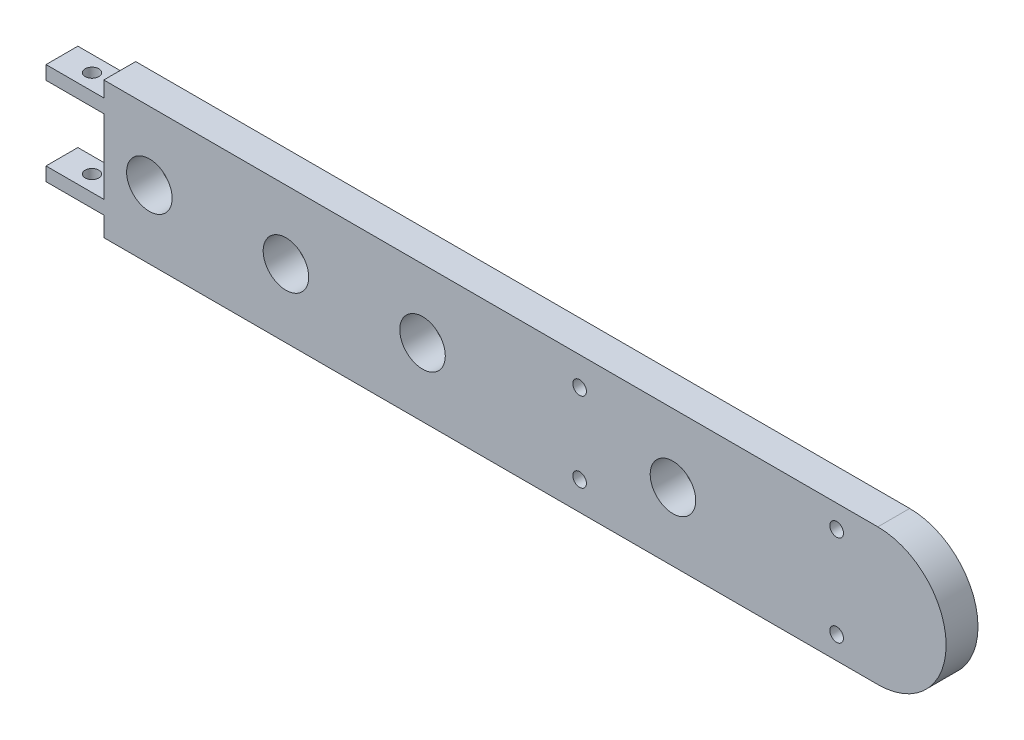
ISO-10303-21;
HEADER;
FILE_DESCRIPTION(('STEP AP214'),'2;1');
FILE_NAME('part.step','',(''),(''),'','','');
FILE_SCHEMA(('AUTOMOTIVE_DESIGN { 1 0 10303 214 1 1 1 1 }'));
ENDSEC;
DATA;
#1=APPLICATION_CONTEXT('core data for automotive mechanical design processes');
#2=APPLICATION_PROTOCOL_DEFINITION('international standard','automotive_design',2000,#1);
#3=PRODUCT_CONTEXT('',#1,'mechanical');
#4=PRODUCT('Part','Part','',(#3));
#5=PRODUCT_RELATED_PRODUCT_CATEGORY('part','',(#4));
#6=PRODUCT_DEFINITION_FORMATION('','',#4);
#7=PRODUCT_DEFINITION_CONTEXT('part definition',#1,'design');
#8=PRODUCT_DEFINITION('design','',#6,#7);
#9=PRODUCT_DEFINITION_SHAPE('','',#8);
#10=(LENGTH_UNIT() NAMED_UNIT(*) SI_UNIT(.MILLI.,.METRE.));
#11=(NAMED_UNIT(*) PLANE_ANGLE_UNIT() SI_UNIT($,.RADIAN.));
#12=(NAMED_UNIT(*) SI_UNIT($,.STERADIAN.) SOLID_ANGLE_UNIT());
#13=UNCERTAINTY_MEASURE_WITH_UNIT(LENGTH_MEASURE(1.E-05),#10,'distance_accuracy_value','');
#14=(GEOMETRIC_REPRESENTATION_CONTEXT(3) GLOBAL_UNCERTAINTY_ASSIGNED_CONTEXT((#13)) GLOBAL_UNIT_ASSIGNED_CONTEXT((#10,
#11,#12)) REPRESENTATION_CONTEXT('',''));
#15=CARTESIAN_POINT('',(0.,0.,0.));
#16=DIRECTION('',(0.,0.,1.));
#17=DIRECTION('',(1.,0.,0.));
#18=AXIS2_PLACEMENT_3D('',#15,#16,#17);
#19=CARTESIAN_POINT('',(-75.,42.916446054331,-10.001));
#20=DIRECTION('',(1.,0.,0.));
#21=DIRECTION('',(0.,1.,0.));
#22=AXIS2_PLACEMENT_3D('',#19,#20,#21);
#23=PLANE('',#22);
#24=DIRECTION('',(0.,0.,-1.));
#25=VECTOR('',#24,1.);
#26=CARTESIAN_POINT('',(-75.,-3.42000859692146,0.));
#27=LINE('',#26,#25);
#28=CARTESIAN_POINT('',(-75.,-3.42000859692146,6.99999999999999));
#29=VERTEX_POINT('',#28);
#30=CARTESIAN_POINT('',(-75.,-3.42000859692146,0.));
#31=VERTEX_POINT('',#30);
#32=EDGE_CURVE('E271',#29,#31,#27,.T.);
#33=ORIENTED_EDGE('',*,*,#32,.F.);
#34=DIRECTION('',(0.,1.,0.));
#35=VECTOR('',#34,1.);
#36=CARTESIAN_POINT('',(-75.,42.916446054331,6.99999999999999));
#37=LINE('',#36,#35);
#38=CARTESIAN_POINT('',(-75.,0.,6.99999999999999));
#39=VERTEX_POINT('',#38);
#40=EDGE_CURVE('E340',#29,#39,#37,.T.);
#41=ORIENTED_EDGE('',*,*,#40,.T.);
#42=DIRECTION('',(0.,0.,-1.));
#43=VECTOR('',#42,1.);
#44=CARTESIAN_POINT('',(-75.,0.,-10.001));
#45=LINE('',#44,#43);
#46=CARTESIAN_POINT('',(-75.,0.,0.));
#47=VERTEX_POINT('',#46);
#48=EDGE_CURVE('E331',#39,#47,#45,.T.);
#49=ORIENTED_EDGE('',*,*,#48,.T.);
#50=DIRECTION('',(0.,1.,0.));
#51=VECTOR('',#50,1.);
#52=CARTESIAN_POINT('',(-75.,42.916446054331,0.));
#53=LINE('',#52,#51);
#54=EDGE_CURVE('E178',#31,#47,#53,.T.);
#55=ORIENTED_EDGE('',*,*,#54,.F.);
#56=EDGE_LOOP('',(#33,#41,#49,#55));
#57=FACE_BOUND('',#56,.T.);
#58=ADVANCED_FACE('F161',(#57),#23,.F.);
#59=DIRECTION('',(0.,0.,1.));
#60=VECTOR('',#59,1.);
#61=CARTESIAN_POINT('',(-75.,-6.42000859692146,0.));
#62=LINE('',#61,#60);
#63=CARTESIAN_POINT('',(-75.,-6.42000859692145,0.));
#64=VERTEX_POINT('',#63);
#65=CARTESIAN_POINT('',(-75.,-6.42000859692146,7.));
#66=VERTEX_POINT('',#65);
#67=EDGE_CURVE('E186',#64,#66,#62,.T.);
#68=ORIENTED_EDGE('',*,*,#67,.F.);
#69=CARTESIAN_POINT('',(-75.,-22.7,0.));
#70=VERTEX_POINT('',#69);
#71=EDGE_CURVE('E277',#70,#64,#53,.T.);
#72=ORIENTED_EDGE('',*,*,#71,.F.);
#73=DIRECTION('',(0.,0.,-1.));
#74=VECTOR('',#73,1.);
#75=CARTESIAN_POINT('',(-75.,-22.7,0.));
#76=LINE('',#75,#74);
#77=CARTESIAN_POINT('',(-75.,-22.7,6.99999999999999));
#78=VERTEX_POINT('',#77);
#79=EDGE_CURVE('E300',#78,#70,#76,.T.);
#80=ORIENTED_EDGE('',*,*,#79,.F.);
#81=EDGE_CURVE('E344',#78,#66,#37,.T.);
#82=ORIENTED_EDGE('',*,*,#81,.T.);
#83=EDGE_LOOP('',(#68,#72,#80,#82));
#84=FACE_BOUND('',#83,.T.);
#85=ADVANCED_FACE('F397',(#84),#23,.F.);
#86=DIRECTION('',(0.,0.,1.));
#87=VECTOR('',#86,1.);
#88=CARTESIAN_POINT('',(-75.,-25.7,0.));
#89=LINE('',#88,#87);
#90=CARTESIAN_POINT('',(-75.,-25.7,0.));
#91=VERTEX_POINT('',#90);
#92=CARTESIAN_POINT('',(-75.,-25.7,6.99999999999999));
#93=VERTEX_POINT('',#92);
#94=EDGE_CURVE('E303',#91,#93,#89,.T.);
#95=ORIENTED_EDGE('',*,*,#94,.F.);
#96=CARTESIAN_POINT('',(-75.,-30.,0.));
#97=VERTEX_POINT('',#96);
#98=EDGE_CURVE('E337',#97,#91,#53,.T.);
#99=ORIENTED_EDGE('',*,*,#98,.F.);
#100=DIRECTION('',(0.,0.,1.));
#101=VECTOR('',#100,1.);
#102=CARTESIAN_POINT('',(-75.,-30.,-10.001));
#103=LINE('',#102,#101);
#104=CARTESIAN_POINT('',(-75.,-30.,6.99999999999999));
#105=VERTEX_POINT('',#104);
#106=EDGE_CURVE('E335',#97,#105,#103,.T.);
#107=ORIENTED_EDGE('',*,*,#106,.T.);
#108=EDGE_CURVE('E341',#105,#93,#37,.T.);
#109=ORIENTED_EDGE('',*,*,#108,.T.);
#110=EDGE_LOOP('',(#95,#99,#107,#109));
#111=FACE_BOUND('',#110,.T.);
#112=ADVANCED_FACE('F424',(#111),#23,.F.);
#113=CARTESIAN_POINT('',(-200.,-15.,0.));
#114=DIRECTION('',(0.,0.,-1.));
#115=DIRECTION('',(-1.,0.,0.));
#116=AXIS2_PLACEMENT_3D('',#113,#114,#115);
#117=PLANE('',#116);
#118=CARTESIAN_POINT('',(85.95,-25.,0.));
#119=DIRECTION('',(0.,0.,-1.));
#120=DIRECTION('',(-1.,0.,0.));
#121=AXIS2_PLACEMENT_3D('',#118,#119,#120);
#122=CIRCLE('',#121,1.49999999999997);
#123=CARTESIAN_POINT('',(84.45,-25.,0.));
#124=VERTEX_POINT('',#123);
#125=EDGE_CURVE('E319',#124,#124,#122,.T.);
#126=ORIENTED_EDGE('',*,*,#125,.F.);
#127=EDGE_LOOP('',(#126));
#128=FACE_BOUND('',#127,.T.);
#129=CARTESIAN_POINT('',(85.95,-4.99999999999997,0.));
#130=DIRECTION('',(0.,0.,-1.));
#131=DIRECTION('',(-1.,0.,0.));
#132=AXIS2_PLACEMENT_3D('',#129,#130,#131);
#133=CIRCLE('',#132,1.49999999999997);
#134=CARTESIAN_POINT('',(84.45,-4.99999999999997,0.));
#135=VERTEX_POINT('',#134);
#136=EDGE_CURVE('E315',#135,#135,#133,.T.);
#137=ORIENTED_EDGE('',*,*,#136,.F.);
#138=EDGE_LOOP('',(#137));
#139=FACE_BOUND('',#138,.T.);
#140=CARTESIAN_POINT('',(50.,-15.,0.));
#141=DIRECTION('',(0.,0.,-1.));
#142=DIRECTION('',(-1.,0.,0.));
#143=AXIS2_PLACEMENT_3D('',#140,#141,#142);
#144=CIRCLE('',#143,5.);
#145=CARTESIAN_POINT('',(45.,-15.,0.));
#146=VERTEX_POINT('',#145);
#147=EDGE_CURVE('E352',#146,#146,#144,.T.);
#148=ORIENTED_EDGE('',*,*,#147,.F.);
#149=EDGE_LOOP('',(#148));
#150=FACE_BOUND('',#149,.T.);
#151=CARTESIAN_POINT('',(95.,-15.,0.));
#152=DIRECTION('',(0.,0.,1.));
#153=DIRECTION('',(1.,0.,0.));
#154=AXIS2_PLACEMENT_3D('',#151,#152,#153);
#155=CIRCLE('',#154,15.);
#156=CARTESIAN_POINT('',(95.,0.,0.));
#157=VERTEX_POINT('',#156);
#158=CARTESIAN_POINT('',(95.,-30.,0.));
#159=VERTEX_POINT('',#158);
#160=EDGE_CURVE('E323',#157,#159,#155,.F.);
#161=ORIENTED_EDGE('',*,*,#160,.T.);
#162=DIRECTION('',(1.,0.,0.));
#163=VECTOR('',#162,1.);
#164=CARTESIAN_POINT('',(50.,-30.,0.));
#165=LINE('',#164,#163);
#166=EDGE_CURVE('E366',#97,#159,#165,.T.);
#167=ORIENTED_EDGE('',*,*,#166,.F.);
#168=ORIENTED_EDGE('',*,*,#98,.T.);
#169=DIRECTION('',(1.,0.,0.));
#170=VECTOR('',#169,1.);
#171=CARTESIAN_POINT('',(-87.7,-25.7,0.));
#172=LINE('',#171,#170);
#173=CARTESIAN_POINT('',(-87.7,-25.7,0.));
#174=VERTEX_POINT('',#173);
#175=EDGE_CURVE('E287',#174,#91,#172,.T.);
#176=ORIENTED_EDGE('',*,*,#175,.F.);
#177=DIRECTION('',(0.,-1.,0.));
#178=VECTOR('',#177,1.);
#179=CARTESIAN_POINT('',(-87.7,-22.7,0.));
#180=LINE('',#179,#178);
#181=CARTESIAN_POINT('',(-87.7,-22.7,0.));
#182=VERTEX_POINT('',#181);
#183=EDGE_CURVE('E304',#182,#174,#180,.T.);
#184=ORIENTED_EDGE('',*,*,#183,.F.);
#185=DIRECTION('',(1.,0.,0.));
#186=VECTOR('',#185,1.);
#187=CARTESIAN_POINT('',(-87.7,-22.7,0.));
#188=LINE('',#187,#186);
#189=EDGE_CURVE('E297',#182,#70,#188,.T.);
#190=ORIENTED_EDGE('',*,*,#189,.T.);
#191=ORIENTED_EDGE('',*,*,#71,.T.);
#192=DIRECTION('',(1.,0.,0.));
#193=VECTOR('',#192,1.);
#194=CARTESIAN_POINT('',(-87.7,-6.42000859692146,0.));
#195=LINE('',#194,#193);
#196=CARTESIAN_POINT('',(-87.7,-6.42000859692146,0.));
#197=VERTEX_POINT('',#196);
#198=EDGE_CURVE('E256',#197,#64,#195,.T.);
#199=ORIENTED_EDGE('',*,*,#198,.F.);
#200=DIRECTION('',(0.,-1.,0.));
#201=VECTOR('',#200,1.);
#202=CARTESIAN_POINT('',(-87.7,-3.42000859692146,0.));
#203=LINE('',#202,#201);
#204=CARTESIAN_POINT('',(-87.7,-3.42000859692146,0.));
#205=VERTEX_POINT('',#204);
#206=EDGE_CURVE('E262',#205,#197,#203,.T.);
#207=ORIENTED_EDGE('',*,*,#206,.F.);
#208=DIRECTION('',(1.,0.,0.));
#209=VECTOR('',#208,1.);
#210=CARTESIAN_POINT('',(-87.7,-3.42000859692146,0.));
#211=LINE('',#210,#209);
#212=EDGE_CURVE('E391',#205,#31,#211,.T.);
#213=ORIENTED_EDGE('',*,*,#212,.T.);
#214=ORIENTED_EDGE('',*,*,#54,.T.);
#215=DIRECTION('',(-1.,0.,0.));
#216=VECTOR('',#215,1.);
#217=CARTESIAN_POINT('',(-200.,0.,0.));
#218=LINE('',#217,#216);
#219=EDGE_CURVE('E381',#157,#47,#218,.T.);
#220=ORIENTED_EDGE('',*,*,#219,.F.);
#221=EDGE_LOOP('',(#161,#167,#168,#176,#184,#190,#191,#199,#207,#213,#214,#220));
#222=FACE_BOUND('',#221,.T.);
#223=CARTESIAN_POINT('',(29.5,-23.75,0.));
#224=DIRECTION('',(0.,0.,-1.));
#225=DIRECTION('',(-1.,0.,0.));
#226=AXIS2_PLACEMENT_3D('',#223,#224,#225);
#227=CIRCLE('',#226,1.5);
#228=CARTESIAN_POINT('',(28.,-23.75,0.));
#229=VERTEX_POINT('',#228);
#230=EDGE_CURVE('E345',#229,#229,#227,.T.);
#231=ORIENTED_EDGE('',*,*,#230,.F.);
#232=EDGE_LOOP('',(#231));
#233=FACE_BOUND('',#232,.T.);
#234=CARTESIAN_POINT('',(29.5,-6.24999999999997,0.));
#235=DIRECTION('',(0.,0.,-1.));
#236=DIRECTION('',(-1.,0.,0.));
#237=AXIS2_PLACEMENT_3D('',#234,#235,#236);
#238=CIRCLE('',#237,1.5);
#239=CARTESIAN_POINT('',(28.,-6.24999999999997,0.));
#240=VERTEX_POINT('',#239);
#241=EDGE_CURVE('E349',#240,#240,#238,.T.);
#242=ORIENTED_EDGE('',*,*,#241,.F.);
#243=EDGE_LOOP('',(#242));
#244=FACE_BOUND('',#243,.T.);
#245=CARTESIAN_POINT('',(-65.,-15.,0.));
#246=DIRECTION('',(0.,0.,1.));
#247=DIRECTION('',(1.,0.,0.));
#248=AXIS2_PLACEMENT_3D('',#245,#246,#247);
#249=CIRCLE('',#248,4.99999999999999);
#250=CARTESIAN_POINT('',(-60.,-15.,0.));
#251=VERTEX_POINT('',#250);
#252=EDGE_CURVE('E363',#251,#251,#249,.T.);
#253=ORIENTED_EDGE('',*,*,#252,.T.);
#254=EDGE_LOOP('',(#253));
#255=FACE_BOUND('',#254,.T.);
#256=CARTESIAN_POINT('',(-35.,-15.,0.));
#257=DIRECTION('',(0.,0.,1.));
#258=DIRECTION('',(1.,0.,0.));
#259=AXIS2_PLACEMENT_3D('',#256,#257,#258);
#260=CIRCLE('',#259,4.99999999999999);
#261=CARTESIAN_POINT('',(-30.,-15.,0.));
#262=VERTEX_POINT('',#261);
#263=EDGE_CURVE('E370',#262,#262,#260,.T.);
#264=ORIENTED_EDGE('',*,*,#263,.T.);
#265=EDGE_LOOP('',(#264));
#266=FACE_BOUND('',#265,.T.);
#267=CARTESIAN_POINT('',(-5.,-15.,0.));
#268=DIRECTION('',(0.,0.,1.));
#269=DIRECTION('',(1.,0.,0.));
#270=AXIS2_PLACEMENT_3D('',#267,#268,#269);
#271=CIRCLE('',#270,4.99999999999999);
#272=CARTESIAN_POINT('',(0.,-15.,0.));
#273=VERTEX_POINT('',#272);
#274=EDGE_CURVE('E376',#273,#273,#271,.T.);
#275=ORIENTED_EDGE('',*,*,#274,.T.);
#276=EDGE_LOOP('',(#275));
#277=FACE_BOUND('',#276,.T.);
#278=ADVANCED_FACE('F274',(#128,#139,#150,#222,#233,#244,#255,#266,#277),#117,.T.);
#279=CARTESIAN_POINT('',(50.,-30.,6.99999999999999));
#280=DIRECTION('',(0.,1.,0.));
#281=DIRECTION('',(-1.,0.,0.));
#282=AXIS2_PLACEMENT_3D('',#279,#280,#281);
#283=PLANE('',#282);
#284=DIRECTION('',(1.,0.,0.));
#285=VECTOR('',#284,1.);
#286=CARTESIAN_POINT('',(50.,-30.,6.99999999999999));
#287=LINE('',#286,#285);
#288=CARTESIAN_POINT('',(95.,-30.,6.99999999999999));
#289=VERTEX_POINT('',#288);
#290=EDGE_CURVE('E170',#105,#289,#287,.T.);
#291=ORIENTED_EDGE('',*,*,#290,.F.);
#292=ORIENTED_EDGE('',*,*,#106,.F.);
#293=ORIENTED_EDGE('',*,*,#166,.T.);
#294=DIRECTION('',(0.,0.,1.));
#295=VECTOR('',#294,1.);
#296=CARTESIAN_POINT('',(95.,-30.,0.));
#297=LINE('',#296,#295);
#298=EDGE_CURVE('E325',#159,#289,#297,.T.);
#299=ORIENTED_EDGE('',*,*,#298,.T.);
#300=EDGE_LOOP('',(#291,#292,#293,#299));
#301=FACE_BOUND('',#300,.T.);
#302=ADVANCED_FACE('F163',(#301),#283,.F.);
#303=CARTESIAN_POINT('',(-200.,0.,6.99999999999999));
#304=DIRECTION('',(0.,-1.,0.));
#305=DIRECTION('',(1.,0.,0.));
#306=AXIS2_PLACEMENT_3D('',#303,#304,#305);
#307=PLANE('',#306);
#308=ORIENTED_EDGE('',*,*,#219,.T.);
#309=ORIENTED_EDGE('',*,*,#48,.F.);
#310=DIRECTION('',(-1.,0.,0.));
#311=VECTOR('',#310,1.);
#312=CARTESIAN_POINT('',(-200.,0.,6.99999999999999));
#313=LINE('',#312,#311);
#314=CARTESIAN_POINT('',(95.,0.,6.99999999999999));
#315=VERTEX_POINT('',#314);
#316=EDGE_CURVE('E12',#315,#39,#313,.T.);
#317=ORIENTED_EDGE('',*,*,#316,.F.);
#318=DIRECTION('',(0.,0.,1.));
#319=VECTOR('',#318,1.);
#320=CARTESIAN_POINT('',(95.,0.,0.));
#321=LINE('',#320,#319);
#322=EDGE_CURVE('E328',#157,#315,#321,.T.);
#323=ORIENTED_EDGE('',*,*,#322,.F.);
#324=EDGE_LOOP('',(#308,#309,#317,#323));
#325=FACE_BOUND('',#324,.T.);
#326=ADVANCED_FACE('F387',(#325),#307,.F.);
#327=CARTESIAN_POINT('',(-200.,-15.,6.99999999999999));
#328=DIRECTION('',(0.,0.,-1.));
#329=DIRECTION('',(-1.,0.,0.));
#330=AXIS2_PLACEMENT_3D('',#327,#328,#329);
#331=PLANE('',#330);
#332=CARTESIAN_POINT('',(85.95,-25.,6.99999999999999));
#333=DIRECTION('',(0.,0.,1.));
#334=DIRECTION('',(1.,0.,0.));
#335=AXIS2_PLACEMENT_3D('',#332,#333,#334);
#336=CIRCLE('',#335,1.49999999999997);
#337=CARTESIAN_POINT('',(87.45,-25.,6.99999999999999));
#338=VERTEX_POINT('',#337);
#339=EDGE_CURVE('E281',#338,#338,#336,.T.);
#340=ORIENTED_EDGE('',*,*,#339,.F.);
#341=EDGE_LOOP('',(#340));
#342=FACE_BOUND('',#341,.T.);
#343=CARTESIAN_POINT('',(85.95,-4.99999999999997,6.99999999999999));
#344=DIRECTION('',(0.,0.,1.));
#345=DIRECTION('',(1.,0.,0.));
#346=AXIS2_PLACEMENT_3D('',#343,#344,#345);
#347=CIRCLE('',#346,1.49999999999997);
#348=CARTESIAN_POINT('',(87.45,-4.99999999999997,6.99999999999999));
#349=VERTEX_POINT('',#348);
#350=EDGE_CURVE('E278',#349,#349,#347,.T.);
#351=ORIENTED_EDGE('',*,*,#350,.F.);
#352=EDGE_LOOP('',(#351));
#353=FACE_BOUND('',#352,.T.);
#354=CARTESIAN_POINT('',(50.,-15.,6.99999999999999));
#355=DIRECTION('',(0.,0.,-1.));
#356=DIRECTION('',(-1.,0.,0.));
#357=AXIS2_PLACEMENT_3D('',#354,#355,#356);
#358=CIRCLE('',#357,5.);
#359=CARTESIAN_POINT('',(45.,-15.,6.99999999999999));
#360=VERTEX_POINT('',#359);
#361=EDGE_CURVE('E359',#360,#360,#358,.T.);
#362=ORIENTED_EDGE('',*,*,#361,.T.);
#363=EDGE_LOOP('',(#362));
#364=FACE_BOUND('',#363,.T.);
#365=CARTESIAN_POINT('',(29.5,-23.75,6.99999999999999));
#366=DIRECTION('',(0.,0.,-1.));
#367=DIRECTION('',(-1.,0.,0.));
#368=AXIS2_PLACEMENT_3D('',#365,#366,#367);
#369=CIRCLE('',#368,1.5);
#370=CARTESIAN_POINT('',(28.,-23.75,6.99999999999999));
#371=VERTEX_POINT('',#370);
#372=EDGE_CURVE('E348',#371,#371,#369,.F.);
#373=ORIENTED_EDGE('',*,*,#372,.F.);
#374=EDGE_LOOP('',(#373));
#375=FACE_BOUND('',#374,.T.);
#376=CARTESIAN_POINT('',(29.5,-6.24999999999997,6.99999999999999));
#377=DIRECTION('',(0.,0.,-1.));
#378=DIRECTION('',(-1.,0.,0.));
#379=AXIS2_PLACEMENT_3D('',#376,#377,#378);
#380=CIRCLE('',#379,1.5);
#381=CARTESIAN_POINT('',(28.,-6.24999999999997,6.99999999999999));
#382=VERTEX_POINT('',#381);
#383=EDGE_CURVE('E343',#382,#382,#380,.F.);
#384=ORIENTED_EDGE('',*,*,#383,.F.);
#385=EDGE_LOOP('',(#384));
#386=FACE_BOUND('',#385,.T.);
#387=ORIENTED_EDGE('',*,*,#290,.T.);
#388=CARTESIAN_POINT('',(95.,-15.,6.99999999999999));
#389=DIRECTION('',(0.,0.,1.));
#390=DIRECTION('',(1.,0.,0.));
#391=AXIS2_PLACEMENT_3D('',#388,#389,#390);
#392=CIRCLE('',#391,15.);
#393=EDGE_CURVE('E322',#315,#289,#392,.F.);
#394=ORIENTED_EDGE('',*,*,#393,.F.);
#395=ORIENTED_EDGE('',*,*,#316,.T.);
#396=ORIENTED_EDGE('',*,*,#40,.F.);
#397=DIRECTION('',(1.,0.,0.));
#398=VECTOR('',#397,1.);
#399=CARTESIAN_POINT('',(-87.7,-3.42000859692146,7.));
#400=LINE('',#399,#398);
#401=CARTESIAN_POINT('',(-87.7,-3.42000859692146,7.));
#402=VERTEX_POINT('',#401);
#403=EDGE_CURVE('E283',#402,#29,#400,.T.);
#404=ORIENTED_EDGE('',*,*,#403,.F.);
#405=DIRECTION('',(0.,1.,0.));
#406=VECTOR('',#405,1.);
#407=CARTESIAN_POINT('',(-87.7,-3.42000859692146,7.));
#408=LINE('',#407,#406);
#409=CARTESIAN_POINT('',(-87.7,-6.42000859692146,7.));
#410=VERTEX_POINT('',#409);
#411=EDGE_CURVE('E261',#410,#402,#408,.T.);
#412=ORIENTED_EDGE('',*,*,#411,.F.);
#413=DIRECTION('',(1.,0.,0.));
#414=VECTOR('',#413,1.);
#415=CARTESIAN_POINT('',(-87.7,-6.42000859692146,7.));
#416=LINE('',#415,#414);
#417=EDGE_CURVE('E258',#410,#66,#416,.T.);
#418=ORIENTED_EDGE('',*,*,#417,.T.);
#419=ORIENTED_EDGE('',*,*,#81,.F.);
#420=DIRECTION('',(1.,0.,0.));
#421=VECTOR('',#420,1.);
#422=CARTESIAN_POINT('',(-87.7,-22.7,6.99999999999999));
#423=LINE('',#422,#421);
#424=CARTESIAN_POINT('',(-87.7,-22.7,6.99999999999999));
#425=VERTEX_POINT('',#424);
#426=EDGE_CURVE('E294',#425,#78,#423,.T.);
#427=ORIENTED_EDGE('',*,*,#426,.F.);
#428=DIRECTION('',(0.,1.,0.));
#429=VECTOR('',#428,1.);
#430=CARTESIAN_POINT('',(-87.7,-22.7,6.99999999999999));
#431=LINE('',#430,#429);
#432=CARTESIAN_POINT('',(-87.7,-25.7,6.99999999999999));
#433=VERTEX_POINT('',#432);
#434=EDGE_CURVE('E308',#433,#425,#431,.T.);
#435=ORIENTED_EDGE('',*,*,#434,.F.);
#436=DIRECTION('',(1.,0.,0.));
#437=VECTOR('',#436,1.);
#438=CARTESIAN_POINT('',(-87.7,-25.7,6.99999999999999));
#439=LINE('',#438,#437);
#440=EDGE_CURVE('E290',#433,#93,#439,.T.);
#441=ORIENTED_EDGE('',*,*,#440,.T.);
#442=ORIENTED_EDGE('',*,*,#108,.F.);
#443=EDGE_LOOP('',(#387,#394,#395,#396,#404,#412,#418,#419,#427,#435,#441,#442));
#444=FACE_BOUND('',#443,.T.);
#445=CARTESIAN_POINT('',(-65.,-15.,6.99999999999999));
#446=DIRECTION('',(0.,0.,1.));
#447=DIRECTION('',(1.,0.,0.));
#448=AXIS2_PLACEMENT_3D('',#445,#446,#447);
#449=CIRCLE('',#448,4.99999999999999);
#450=CARTESIAN_POINT('',(-60.,-15.,6.99999999999999));
#451=VERTEX_POINT('',#450);
#452=EDGE_CURVE('E367',#451,#451,#449,.T.);
#453=ORIENTED_EDGE('',*,*,#452,.F.);
#454=EDGE_LOOP('',(#453));
#455=FACE_BOUND('',#454,.T.);
#456=CARTESIAN_POINT('',(-35.,-15.,6.99999999999999));
#457=DIRECTION('',(0.,0.,1.));
#458=DIRECTION('',(1.,0.,0.));
#459=AXIS2_PLACEMENT_3D('',#456,#457,#458);
#460=CIRCLE('',#459,4.99999999999999);
#461=CARTESIAN_POINT('',(-30.,-15.,6.99999999999999));
#462=VERTEX_POINT('',#461);
#463=EDGE_CURVE('E373',#462,#462,#460,.T.);
#464=ORIENTED_EDGE('',*,*,#463,.F.);
#465=EDGE_LOOP('',(#464));
#466=FACE_BOUND('',#465,.T.);
#467=CARTESIAN_POINT('',(-5.,-15.,6.99999999999999));
#468=DIRECTION('',(0.,0.,1.));
#469=DIRECTION('',(1.,0.,0.));
#470=AXIS2_PLACEMENT_3D('',#467,#468,#469);
#471=CIRCLE('',#470,4.99999999999999);
#472=CARTESIAN_POINT('',(0.,-15.,6.99999999999999));
#473=VERTEX_POINT('',#472);
#474=EDGE_CURVE('E362',#473,#473,#471,.T.);
#475=ORIENTED_EDGE('',*,*,#474,.F.);
#476=EDGE_LOOP('',(#475));
#477=FACE_BOUND('',#476,.T.);
#478=ADVANCED_FACE('F400',(#342,#353,#364,#375,#386,#444,#455,#466,#477),#331,.F.);
#479=CARTESIAN_POINT('',(-5.,-15.,0.));
#480=DIRECTION('',(0.,0.,1.));
#481=DIRECTION('',(1.,0.,0.));
#482=AXIS2_PLACEMENT_3D('',#479,#480,#481);
#483=CYLINDRICAL_SURFACE('',#482,4.99999999999999);
#484=ORIENTED_EDGE('',*,*,#274,.F.);
#485=EDGE_LOOP('',(#484));
#486=FACE_BOUND('',#485,.T.);
#487=ORIENTED_EDGE('',*,*,#474,.T.);
#488=EDGE_LOOP('',(#487));
#489=FACE_BOUND('',#488,.T.);
#490=ADVANCED_FACE('F550',(#486,#489),#483,.F.);
#491=CARTESIAN_POINT('',(-35.,-15.,0.));
#492=DIRECTION('',(0.,0.,1.));
#493=DIRECTION('',(1.,0.,0.));
#494=AXIS2_PLACEMENT_3D('',#491,#492,#493);
#495=CYLINDRICAL_SURFACE('',#494,4.99999999999999);
#496=ORIENTED_EDGE('',*,*,#263,.F.);
#497=EDGE_LOOP('',(#496));
#498=FACE_BOUND('',#497,.T.);
#499=ORIENTED_EDGE('',*,*,#463,.T.);
#500=EDGE_LOOP('',(#499));
#501=FACE_BOUND('',#500,.T.);
#502=ADVANCED_FACE('F655',(#498,#501),#495,.F.);
#503=CARTESIAN_POINT('',(-65.,-15.,0.));
#504=DIRECTION('',(0.,0.,1.));
#505=DIRECTION('',(1.,0.,0.));
#506=AXIS2_PLACEMENT_3D('',#503,#504,#505);
#507=CYLINDRICAL_SURFACE('',#506,4.99999999999999);
#508=ORIENTED_EDGE('',*,*,#252,.F.);
#509=EDGE_LOOP('',(#508));
#510=FACE_BOUND('',#509,.T.);
#511=ORIENTED_EDGE('',*,*,#452,.T.);
#512=EDGE_LOOP('',(#511));
#513=FACE_BOUND('',#512,.T.);
#514=ADVANCED_FACE('F651',(#510,#513),#507,.F.);
#515=CARTESIAN_POINT('',(50.,-15.,10.));
#516=DIRECTION('',(0.,0.,-1.));
#517=DIRECTION('',(-1.,0.,0.));
#518=AXIS2_PLACEMENT_3D('',#515,#516,#517);
#519=CYLINDRICAL_SURFACE('',#518,5.);
#520=ORIENTED_EDGE('',*,*,#147,.T.);
#521=EDGE_LOOP('',(#520));
#522=FACE_BOUND('',#521,.T.);
#523=ORIENTED_EDGE('',*,*,#361,.F.);
#524=EDGE_LOOP('',(#523));
#525=FACE_BOUND('',#524,.T.);
#526=ADVANCED_FACE('F644',(#522,#525),#519,.F.);
#527=CARTESIAN_POINT('',(29.5,-6.24999999999997,7.00099999999999));
#528=DIRECTION('',(0.,0.,-1.));
#529=DIRECTION('',(-1.,0.,0.));
#530=AXIS2_PLACEMENT_3D('',#527,#528,#529);
#531=CYLINDRICAL_SURFACE('',#530,1.5);
#532=ORIENTED_EDGE('',*,*,#241,.T.);
#533=EDGE_LOOP('',(#532));
#534=FACE_BOUND('',#533,.T.);
#535=ORIENTED_EDGE('',*,*,#383,.T.);
#536=EDGE_LOOP('',(#535));
#537=FACE_BOUND('',#536,.T.);
#538=ADVANCED_FACE('F467',(#534,#537),#531,.F.);
#539=CARTESIAN_POINT('',(29.5,-23.75,7.00099999999999));
#540=DIRECTION('',(0.,0.,-1.));
#541=DIRECTION('',(-1.,0.,0.));
#542=AXIS2_PLACEMENT_3D('',#539,#540,#541);
#543=CYLINDRICAL_SURFACE('',#542,1.5);
#544=ORIENTED_EDGE('',*,*,#230,.T.);
#545=EDGE_LOOP('',(#544));
#546=FACE_BOUND('',#545,.T.);
#547=ORIENTED_EDGE('',*,*,#372,.T.);
#548=EDGE_LOOP('',(#547));
#549=FACE_BOUND('',#548,.T.);
#550=ADVANCED_FACE('F458',(#546,#549),#543,.F.);
#551=CARTESIAN_POINT('',(95.,-15.,0.));
#552=DIRECTION('',(0.,0.,1.));
#553=DIRECTION('',(1.,0.,0.));
#554=AXIS2_PLACEMENT_3D('',#551,#552,#553);
#555=CYLINDRICAL_SURFACE('',#554,15.);
#556=ORIENTED_EDGE('',*,*,#393,.T.);
#557=ORIENTED_EDGE('',*,*,#298,.F.);
#558=ORIENTED_EDGE('',*,*,#160,.F.);
#559=ORIENTED_EDGE('',*,*,#322,.T.);
#560=EDGE_LOOP('',(#556,#557,#558,#559));
#561=FACE_BOUND('',#560,.T.);
#562=ADVANCED_FACE('F455',(#561),#555,.T.);
#563=CARTESIAN_POINT('',(85.95,-4.99999999999997,-3.00000000000001));
#564=DIRECTION('',(0.,0.,1.));
#565=DIRECTION('',(1.,0.,0.));
#566=AXIS2_PLACEMENT_3D('',#563,#564,#565);
#567=CYLINDRICAL_SURFACE('',#566,1.49999999999997);
#568=ORIENTED_EDGE('',*,*,#136,.T.);
#569=EDGE_LOOP('',(#568));
#570=FACE_BOUND('',#569,.T.);
#571=ORIENTED_EDGE('',*,*,#350,.T.);
#572=EDGE_LOOP('',(#571));
#573=FACE_BOUND('',#572,.T.);
#574=ADVANCED_FACE('F457',(#570,#573),#567,.F.);
#575=CARTESIAN_POINT('',(85.95,-25.,-3.00000000000001));
#576=DIRECTION('',(0.,0.,1.));
#577=DIRECTION('',(1.,0.,0.));
#578=AXIS2_PLACEMENT_3D('',#575,#576,#577);
#579=CYLINDRICAL_SURFACE('',#578,1.49999999999997);
#580=ORIENTED_EDGE('',*,*,#125,.T.);
#581=EDGE_LOOP('',(#580));
#582=FACE_BOUND('',#581,.T.);
#583=ORIENTED_EDGE('',*,*,#339,.T.);
#584=EDGE_LOOP('',(#583));
#585=FACE_BOUND('',#584,.T.);
#586=ADVANCED_FACE('F463',(#582,#585),#579,.F.);
#587=CARTESIAN_POINT('',(-87.7,-25.7,0.));
#588=DIRECTION('',(0.,1.,0.));
#589=DIRECTION('',(-1.,0.,0.));
#590=AXIS2_PLACEMENT_3D('',#587,#588,#589);
#591=PLANE('',#590);
#592=CARTESIAN_POINT('',(-81.1,-25.7,3.49999999999999));
#593=DIRECTION('',(0.,1.,0.));
#594=DIRECTION('',(-1.,0.,0.));
#595=AXIS2_PLACEMENT_3D('',#592,#593,#594);
#596=CIRCLE('',#595,1.5);
#597=CARTESIAN_POINT('',(-82.6,-25.7,3.49999999999999));
#598=VERTEX_POINT('',#597);
#599=EDGE_CURVE('E291',#598,#598,#596,.T.);
#600=ORIENTED_EDGE('',*,*,#599,.T.);
#601=EDGE_LOOP('',(#600));
#602=FACE_BOUND('',#601,.T.);
#603=ORIENTED_EDGE('',*,*,#94,.T.);
#604=ORIENTED_EDGE('',*,*,#440,.F.);
#605=DIRECTION('',(0.,0.,1.));
#606=VECTOR('',#605,1.);
#607=CARTESIAN_POINT('',(-87.7,-25.7,0.));
#608=LINE('',#607,#606);
#609=EDGE_CURVE('E310',#174,#433,#608,.T.);
#610=ORIENTED_EDGE('',*,*,#609,.F.);
#611=ORIENTED_EDGE('',*,*,#175,.T.);
#612=EDGE_LOOP('',(#603,#604,#610,#611));
#613=FACE_BOUND('',#612,.T.);
#614=ADVANCED_FACE('F444',(#602,#613),#591,.F.);
#615=CARTESIAN_POINT('',(-87.7,-22.7,0.));
#616=DIRECTION('',(0.,-1.,0.));
#617=DIRECTION('',(1.,0.,0.));
#618=AXIS2_PLACEMENT_3D('',#615,#616,#617);
#619=PLANE('',#618);
#620=CARTESIAN_POINT('',(-81.1,-22.7,3.49999999999999));
#621=DIRECTION('',(0.,-1.,0.));
#622=DIRECTION('',(1.,0.,0.));
#623=AXIS2_PLACEMENT_3D('',#620,#621,#622);
#624=CIRCLE('',#623,1.5);
#625=CARTESIAN_POINT('',(-79.6,-22.7,3.49999999999999));
#626=VERTEX_POINT('',#625);
#627=EDGE_CURVE('E484',#626,#626,#624,.T.);
#628=ORIENTED_EDGE('',*,*,#627,.T.);
#629=EDGE_LOOP('',(#628));
#630=FACE_BOUND('',#629,.T.);
#631=ORIENTED_EDGE('',*,*,#79,.T.);
#632=ORIENTED_EDGE('',*,*,#189,.F.);
#633=DIRECTION('',(0.,0.,-1.));
#634=VECTOR('',#633,1.);
#635=CARTESIAN_POINT('',(-87.7,-22.7,0.));
#636=LINE('',#635,#634);
#637=EDGE_CURVE('E299',#425,#182,#636,.T.);
#638=ORIENTED_EDGE('',*,*,#637,.F.);
#639=ORIENTED_EDGE('',*,*,#426,.T.);
#640=EDGE_LOOP('',(#631,#632,#638,#639));
#641=FACE_BOUND('',#640,.T.);
#642=ADVANCED_FACE('F450',(#630,#641),#619,.F.);
#643=CARTESIAN_POINT('',(-87.7,0.,0.));
#644=DIRECTION('',(-1.,0.,0.));
#645=DIRECTION('',(0.,0.,1.));
#646=AXIS2_PLACEMENT_3D('',#643,#644,#645);
#647=PLANE('',#646);
#648=ORIENTED_EDGE('',*,*,#183,.T.);
#649=ORIENTED_EDGE('',*,*,#609,.T.);
#650=ORIENTED_EDGE('',*,*,#434,.T.);
#651=ORIENTED_EDGE('',*,*,#637,.T.);
#652=EDGE_LOOP('',(#648,#649,#650,#651));
#653=FACE_BOUND('',#652,.T.);
#654=ADVANCED_FACE('F418',(#653),#647,.T.);
#655=CARTESIAN_POINT('',(-87.7,-6.42000859692146,0.));
#656=DIRECTION('',(0.,1.,0.));
#657=DIRECTION('',(-1.,0.,0.));
#658=AXIS2_PLACEMENT_3D('',#655,#656,#657);
#659=PLANE('',#658);
#660=CARTESIAN_POINT('',(-81.1,-6.42000859692146,3.49999999999999));
#661=DIRECTION('',(0.,1.,0.));
#662=DIRECTION('',(-1.,0.,0.));
#663=AXIS2_PLACEMENT_3D('',#660,#661,#662);
#664=CIRCLE('',#663,1.5);
#665=CARTESIAN_POINT('',(-82.6,-6.42000859692146,3.49999999999999));
#666=VERTEX_POINT('',#665);
#667=EDGE_CURVE('E487',#666,#666,#664,.T.);
#668=ORIENTED_EDGE('',*,*,#667,.T.);
#669=EDGE_LOOP('',(#668));
#670=FACE_BOUND('',#669,.T.);
#671=ORIENTED_EDGE('',*,*,#67,.T.);
#672=ORIENTED_EDGE('',*,*,#417,.F.);
#673=DIRECTION('',(0.,0.,1.));
#674=VECTOR('',#673,1.);
#675=CARTESIAN_POINT('',(-87.7,-6.42000859692146,0.));
#676=LINE('',#675,#674);
#677=EDGE_CURVE('E252',#197,#410,#676,.T.);
#678=ORIENTED_EDGE('',*,*,#677,.F.);
#679=ORIENTED_EDGE('',*,*,#198,.T.);
#680=EDGE_LOOP('',(#671,#672,#678,#679));
#681=FACE_BOUND('',#680,.T.);
#682=ADVANCED_FACE('F254',(#670,#681),#659,.F.);
#683=CARTESIAN_POINT('',(-87.7,-3.42000859692146,0.));
#684=DIRECTION('',(0.,-1.,0.));
#685=DIRECTION('',(1.,0.,0.));
#686=AXIS2_PLACEMENT_3D('',#683,#684,#685);
#687=PLANE('',#686);
#688=CARTESIAN_POINT('',(-81.1,-3.42000859692146,3.49999999999999));
#689=DIRECTION('',(0.,-1.,0.));
#690=DIRECTION('',(1.,0.,0.));
#691=AXIS2_PLACEMENT_3D('',#688,#689,#690);
#692=CIRCLE('',#691,1.5);
#693=CARTESIAN_POINT('',(-79.6,-3.42000859692146,3.49999999999999));
#694=VERTEX_POINT('',#693);
#695=EDGE_CURVE('E165',#694,#694,#692,.T.);
#696=ORIENTED_EDGE('',*,*,#695,.T.);
#697=EDGE_LOOP('',(#696));
#698=FACE_BOUND('',#697,.T.);
#699=ORIENTED_EDGE('',*,*,#32,.T.);
#700=ORIENTED_EDGE('',*,*,#212,.F.);
#701=DIRECTION('',(0.,0.,-1.));
#702=VECTOR('',#701,1.);
#703=CARTESIAN_POINT('',(-87.7,-3.42000859692146,0.));
#704=LINE('',#703,#702);
#705=EDGE_CURVE('E267',#402,#205,#704,.T.);
#706=ORIENTED_EDGE('',*,*,#705,.F.);
#707=ORIENTED_EDGE('',*,*,#403,.T.);
#708=EDGE_LOOP('',(#699,#700,#706,#707));
#709=FACE_BOUND('',#708,.T.);
#710=ADVANCED_FACE('F407',(#698,#709),#687,.F.);
#711=CARTESIAN_POINT('',(-87.7,0.,0.));
#712=DIRECTION('',(-1.,0.,0.));
#713=DIRECTION('',(0.,0.,1.));
#714=AXIS2_PLACEMENT_3D('',#711,#712,#713);
#715=PLANE('',#714);
#716=ORIENTED_EDGE('',*,*,#206,.T.);
#717=ORIENTED_EDGE('',*,*,#677,.T.);
#718=ORIENTED_EDGE('',*,*,#411,.T.);
#719=ORIENTED_EDGE('',*,*,#705,.T.);
#720=EDGE_LOOP('',(#716,#717,#718,#719));
#721=FACE_BOUND('',#720,.T.);
#722=ADVANCED_FACE('F265',(#721),#715,.T.);
#723=CARTESIAN_POINT('',(-81.1,-30.,3.49999999999999));
#724=DIRECTION('',(0.,1.,0.));
#725=DIRECTION('',(-1.,0.,0.));
#726=AXIS2_PLACEMENT_3D('',#723,#724,#725);
#727=CYLINDRICAL_SURFACE('',#726,1.5);
#728=ORIENTED_EDGE('',*,*,#695,.F.);
#729=EDGE_LOOP('',(#728));
#730=FACE_BOUND('',#729,.T.);
#731=ORIENTED_EDGE('',*,*,#667,.F.);
#732=EDGE_LOOP('',(#731));
#733=FACE_BOUND('',#732,.T.);
#734=ADVANCED_FACE('F416',(#730,#733),#727,.F.);
#735=ORIENTED_EDGE('',*,*,#627,.F.);
#736=EDGE_LOOP('',(#735));
#737=FACE_BOUND('',#736,.T.);
#738=ORIENTED_EDGE('',*,*,#599,.F.);
#739=EDGE_LOOP('',(#738));
#740=FACE_BOUND('',#739,.T.);
#741=ADVANCED_FACE('F495',(#737,#740),#727,.F.);
#742=CLOSED_SHELL('',(#58,#85,#112,#278,#302,#326,#478,#490,#502,#514,#526,#538,#550,#562,#574,
#586,#614,#642,#654,#682,#710,#722,#734,#741));
#743=MANIFOLD_SOLID_BREP('B2',#742);
#744=ADVANCED_BREP_SHAPE_REPRESENTATION('',(#18,#743),#14);
#745=SHAPE_DEFINITION_REPRESENTATION(#9,#744);
ENDSEC;
END-ISO-10303-21;
